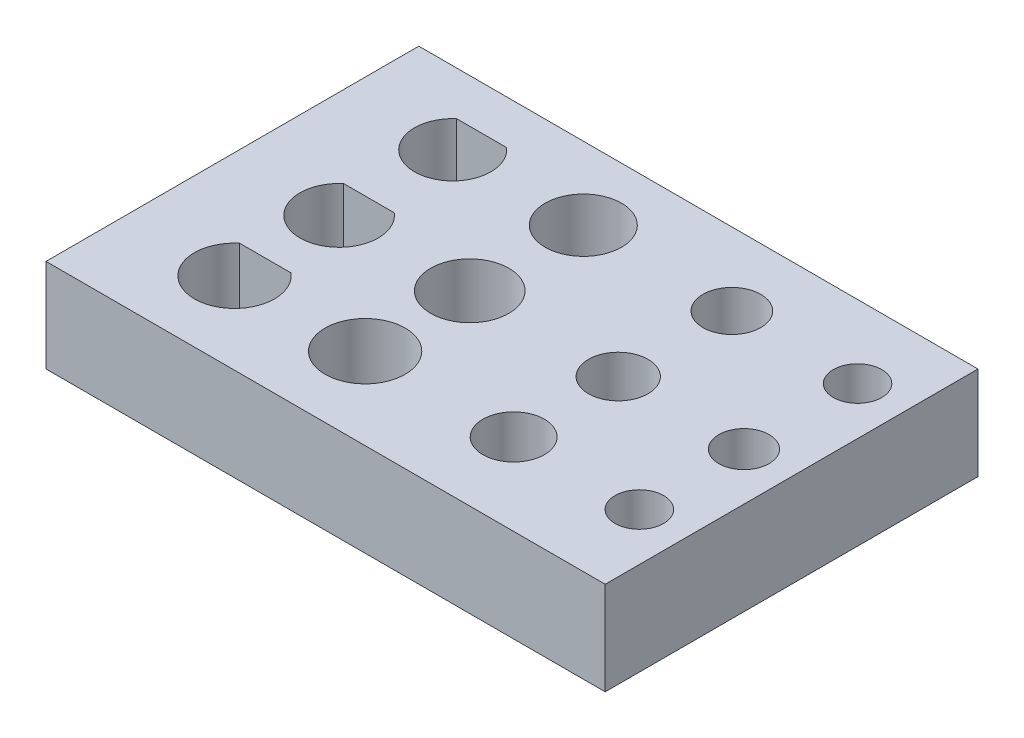
ISO-10303-21;
HEADER;
FILE_DESCRIPTION(('STEP AP214'),'2;1');
FILE_NAME('part.step','',(''),(''),'','','');
FILE_SCHEMA(('AUTOMOTIVE_DESIGN { 1 0 10303 214 1 1 1 1 }'));
ENDSEC;
DATA;
#1=APPLICATION_CONTEXT('core data for automotive mechanical design processes');
#2=APPLICATION_PROTOCOL_DEFINITION('international standard','automotive_design',2000,#1);
#3=PRODUCT_CONTEXT('',#1,'mechanical');
#4=PRODUCT('Part','Part','',(#3));
#5=PRODUCT_RELATED_PRODUCT_CATEGORY('part','',(#4));
#6=PRODUCT_DEFINITION_FORMATION('','',#4);
#7=PRODUCT_DEFINITION_CONTEXT('part definition',#1,'design');
#8=PRODUCT_DEFINITION('design','',#6,#7);
#9=PRODUCT_DEFINITION_SHAPE('','',#8);
#10=(LENGTH_UNIT() NAMED_UNIT(*) SI_UNIT(.MILLI.,.METRE.));
#11=(NAMED_UNIT(*) PLANE_ANGLE_UNIT() SI_UNIT($,.RADIAN.));
#12=(NAMED_UNIT(*) SI_UNIT($,.STERADIAN.) SOLID_ANGLE_UNIT());
#13=UNCERTAINTY_MEASURE_WITH_UNIT(LENGTH_MEASURE(1.E-05),#10,'distance_accuracy_value','');
#14=(GEOMETRIC_REPRESENTATION_CONTEXT(3) GLOBAL_UNCERTAINTY_ASSIGNED_CONTEXT((#13)) GLOBAL_UNIT_ASSIGNED_CONTEXT((#10,
#11,#12)) REPRESENTATION_CONTEXT('',''));
#15=CARTESIAN_POINT('',(0.,0.,0.));
#16=DIRECTION('',(0.,0.,1.));
#17=DIRECTION('',(1.,0.,0.));
#18=AXIS2_PLACEMENT_3D('',#15,#16,#17);
#19=CARTESIAN_POINT('',(0.,5.,0.));
#20=DIRECTION('',(0.,0.,-1.));
#21=DIRECTION('',(-1.,0.,0.));
#22=AXIS2_PLACEMENT_3D('',#19,#20,#21);
#23=PLANE('',#22);
#24=DIRECTION('',(1.,0.,0.));
#25=VECTOR('',#24,1.);
#26=CARTESIAN_POINT('',(0.,0.,0.));
#27=LINE('',#26,#25);
#28=CARTESIAN_POINT('',(0.,0.,0.));
#29=VERTEX_POINT('',#28);
#30=CARTESIAN_POINT('',(30.,0.,0.));
#31=VERTEX_POINT('',#30);
#32=EDGE_CURVE('E212',#29,#31,#27,.T.);
#33=ORIENTED_EDGE('',*,*,#32,.T.);
#34=DIRECTION('',(0.,-1.,0.));
#35=VECTOR('',#34,1.);
#36=CARTESIAN_POINT('',(30.,5.,0.));
#37=LINE('',#36,#35);
#38=CARTESIAN_POINT('',(30.,5.,0.));
#39=VERTEX_POINT('',#38);
#40=EDGE_CURVE('E11',#39,#31,#37,.T.);
#41=ORIENTED_EDGE('',*,*,#40,.F.);
#42=DIRECTION('',(1.,0.,0.));
#43=VECTOR('',#42,1.);
#44=CARTESIAN_POINT('',(0.,5.,0.));
#45=LINE('',#44,#43);
#46=CARTESIAN_POINT('',(0.,5.,0.));
#47=VERTEX_POINT('',#46);
#48=EDGE_CURVE('E215',#47,#39,#45,.T.);
#49=ORIENTED_EDGE('',*,*,#48,.F.);
#50=DIRECTION('',(0.,-1.,0.));
#51=VECTOR('',#50,1.);
#52=CARTESIAN_POINT('',(0.,5.,0.));
#53=LINE('',#52,#51);
#54=EDGE_CURVE('E227',#47,#29,#53,.T.);
#55=ORIENTED_EDGE('',*,*,#54,.T.);
#56=EDGE_LOOP('',(#33,#41,#49,#55));
#57=FACE_BOUND('',#56,.T.);
#58=ADVANCED_FACE('F39',(#57),#23,.F.);
#59=CARTESIAN_POINT('',(30.,5.,0.));
#60=DIRECTION('',(-1.,0.,0.));
#61=DIRECTION('',(0.,0.,1.));
#62=AXIS2_PLACEMENT_3D('',#59,#60,#61);
#63=PLANE('',#62);
#64=DIRECTION('',(0.,0.,-1.));
#65=VECTOR('',#64,1.);
#66=CARTESIAN_POINT('',(30.,0.,0.));
#67=LINE('',#66,#65);
#68=CARTESIAN_POINT('',(30.,0.,-20.));
#69=VERTEX_POINT('',#68);
#70=EDGE_CURVE('E230',#31,#69,#67,.T.);
#71=ORIENTED_EDGE('',*,*,#70,.T.);
#72=DIRECTION('',(0.,-1.,0.));
#73=VECTOR('',#72,1.);
#74=CARTESIAN_POINT('',(30.,5.,-20.));
#75=LINE('',#74,#73);
#76=CARTESIAN_POINT('',(30.,5.,-20.));
#77=VERTEX_POINT('',#76);
#78=EDGE_CURVE('E46',#77,#69,#75,.T.);
#79=ORIENTED_EDGE('',*,*,#78,.F.);
#80=DIRECTION('',(0.,0.,-1.));
#81=VECTOR('',#80,1.);
#82=CARTESIAN_POINT('',(30.,5.,0.));
#83=LINE('',#82,#81);
#84=EDGE_CURVE('E218',#39,#77,#83,.T.);
#85=ORIENTED_EDGE('',*,*,#84,.F.);
#86=ORIENTED_EDGE('',*,*,#40,.T.);
#87=EDGE_LOOP('',(#71,#79,#85,#86));
#88=FACE_BOUND('',#87,.T.);
#89=ADVANCED_FACE('F246',(#88),#63,.F.);
#90=CARTESIAN_POINT('',(0.,5.,-20.));
#91=DIRECTION('',(0.,0.,-1.));
#92=DIRECTION('',(-1.,0.,0.));
#93=AXIS2_PLACEMENT_3D('',#90,#91,#92);
#94=PLANE('',#93);
#95=DIRECTION('',(1.,0.,0.));
#96=VECTOR('',#95,1.);
#97=CARTESIAN_POINT('',(0.,0.,-20.));
#98=LINE('',#97,#96);
#99=CARTESIAN_POINT('',(0.,0.,-20.));
#100=VERTEX_POINT('',#99);
#101=EDGE_CURVE('E233',#100,#69,#98,.T.);
#102=ORIENTED_EDGE('',*,*,#101,.F.);
#103=DIRECTION('',(0.,-1.,0.));
#104=VECTOR('',#103,1.);
#105=CARTESIAN_POINT('',(0.,5.,-20.));
#106=LINE('',#105,#104);
#107=CARTESIAN_POINT('',(0.,5.,-20.));
#108=VERTEX_POINT('',#107);
#109=EDGE_CURVE('E239',#108,#100,#106,.T.);
#110=ORIENTED_EDGE('',*,*,#109,.F.);
#111=DIRECTION('',(1.,0.,0.));
#112=VECTOR('',#111,1.);
#113=CARTESIAN_POINT('',(0.,5.,-20.));
#114=LINE('',#113,#112);
#115=EDGE_CURVE('E221',#108,#77,#114,.T.);
#116=ORIENTED_EDGE('',*,*,#115,.T.);
#117=ORIENTED_EDGE('',*,*,#78,.T.);
#118=EDGE_LOOP('',(#102,#110,#116,#117));
#119=FACE_BOUND('',#118,.T.);
#120=ADVANCED_FACE('F243',(#119),#94,.T.);
#121=CARTESIAN_POINT('',(0.,5.,0.));
#122=DIRECTION('',(-1.,0.,0.));
#123=DIRECTION('',(0.,0.,1.));
#124=AXIS2_PLACEMENT_3D('',#121,#122,#123);
#125=PLANE('',#124);
#126=DIRECTION('',(0.,0.,-1.));
#127=VECTOR('',#126,1.);
#128=CARTESIAN_POINT('',(0.,0.,0.));
#129=LINE('',#128,#127);
#130=EDGE_CURVE('E219',#29,#100,#129,.T.);
#131=ORIENTED_EDGE('',*,*,#130,.F.);
#132=ORIENTED_EDGE('',*,*,#54,.F.);
#133=DIRECTION('',(0.,0.,-1.));
#134=VECTOR('',#133,1.);
#135=CARTESIAN_POINT('',(0.,5.,0.));
#136=LINE('',#135,#134);
#137=EDGE_CURVE('E224',#47,#108,#136,.T.);
#138=ORIENTED_EDGE('',*,*,#137,.T.);
#139=ORIENTED_EDGE('',*,*,#109,.T.);
#140=EDGE_LOOP('',(#131,#132,#138,#139));
#141=FACE_BOUND('',#140,.T.);
#142=ADVANCED_FACE('F253',(#141),#125,.T.);
#143=CARTESIAN_POINT('',(0.,5.,0.));
#144=DIRECTION('',(0.,1.,0.));
#145=DIRECTION('',(0.,0.,1.));
#146=AXIS2_PLACEMENT_3D('',#143,#144,#145);
#147=PLANE('',#146);
#148=CARTESIAN_POINT('',(20.7007957649499,5.,-4.38773686623069));
#149=DIRECTION('',(0.,1.,0.));
#150=DIRECTION('',(0.,0.,1.));
#151=AXIS2_PLACEMENT_3D('',#148,#149,#150);
#152=CIRCLE('',#151,1.65);
#153=CARTESIAN_POINT('',(20.7007957649499,5.,-2.73773686623069));
#154=VERTEX_POINT('',#153);
#155=EDGE_CURVE('E161',#154,#154,#152,.T.);
#156=ORIENTED_EDGE('',*,*,#155,.F.);
#157=EDGE_LOOP('',(#156));
#158=FACE_BOUND('',#157,.T.);
#159=CARTESIAN_POINT('',(5.72533160804216,5.,-4.38773686623069));
#160=DIRECTION('',(0.,1.,0.));
#161=DIRECTION('',(0.,0.,1.));
#162=AXIS2_PLACEMENT_3D('',#159,#160,#161);
#163=CIRCLE('',#162,2.15);
#164=CARTESIAN_POINT('',(4.34692673283313,5.,-6.03773686623069));
#165=VERTEX_POINT('',#164);
#166=CARTESIAN_POINT('',(7.10373648325118,5.,-6.03773686623069));
#167=VERTEX_POINT('',#166);
#168=EDGE_CURVE('E53',#165,#167,#163,.T.);
#169=ORIENTED_EDGE('',*,*,#168,.F.);
#170=DIRECTION('',(-1.,0.,0.));
#171=VECTOR('',#170,1.);
#172=CARTESIAN_POINT('',(4.34692673283313,5.,-6.03773686623069));
#173=LINE('',#172,#171);
#174=EDGE_CURVE('E162',#167,#165,#173,.T.);
#175=ORIENTED_EDGE('',*,*,#174,.F.);
#176=EDGE_LOOP('',(#169,#175));
#177=FACE_BOUND('',#176,.T.);
#178=CARTESIAN_POINT('',(12.7325835816661,5.,-16.0937846010157));
#179=DIRECTION('',(0.,1.,0.));
#180=DIRECTION('',(0.,0.,1.));
#181=AXIS2_PLACEMENT_3D('',#178,#179,#180);
#182=CIRCLE('',#181,2.05);
#183=CARTESIAN_POINT('',(12.7325835816661,5.,-14.0437846010157));
#184=VERTEX_POINT('',#183);
#185=EDGE_CURVE('E150',#184,#184,#182,.T.);
#186=ORIENTED_EDGE('',*,*,#185,.F.);
#187=EDGE_LOOP('',(#186));
#188=FACE_BOUND('',#187,.T.);
#189=CARTESIAN_POINT('',(27.44453044909,5.,-16.0937846010157));
#190=DIRECTION('',(0.,1.,0.));
#191=DIRECTION('',(0.,0.,1.));
#192=AXIS2_PLACEMENT_3D('',#189,#190,#191);
#193=CIRCLE('',#192,1.3);
#194=CARTESIAN_POINT('',(27.44453044909,5.,-14.7937846010157));
#195=VERTEX_POINT('',#194);
#196=EDGE_CURVE('E143',#195,#195,#193,.T.);
#197=ORIENTED_EDGE('',*,*,#196,.F.);
#198=EDGE_LOOP('',(#197));
#199=FACE_BOUND('',#198,.T.);
#200=CARTESIAN_POINT('',(20.7007957649499,5.,-10.));
#201=DIRECTION('',(0.,1.,0.));
#202=DIRECTION('',(0.,0.,1.));
#203=AXIS2_PLACEMENT_3D('',#200,#201,#202);
#204=CIRCLE('',#203,1.6);
#205=CARTESIAN_POINT('',(20.7007957649499,5.,-8.4));
#206=VERTEX_POINT('',#205);
#207=EDGE_CURVE('E189',#206,#206,#204,.T.);
#208=ORIENTED_EDGE('',*,*,#207,.F.);
#209=EDGE_LOOP('',(#208));
#210=FACE_BOUND('',#209,.T.);
#211=CARTESIAN_POINT('',(5.72533160804216,5.,-10.));
#212=DIRECTION('',(0.,1.,0.));
#213=DIRECTION('',(0.,0.,1.));
#214=AXIS2_PLACEMENT_3D('',#211,#212,#213);
#215=CIRCLE('',#214,2.1);
#216=CARTESIAN_POINT('',(4.36518455716861,5.,-11.6));
#217=VERTEX_POINT('',#216);
#218=CARTESIAN_POINT('',(7.0854786589157,5.,-11.6));
#219=VERTEX_POINT('',#218);
#220=EDGE_CURVE('E61',#217,#219,#215,.T.);
#221=ORIENTED_EDGE('',*,*,#220,.F.);
#222=DIRECTION('',(-1.,0.,0.));
#223=VECTOR('',#222,1.);
#224=CARTESIAN_POINT('',(4.36518455716861,5.,-11.6));
#225=LINE('',#224,#223);
#226=EDGE_CURVE('E200',#219,#217,#225,.T.);
#227=ORIENTED_EDGE('',*,*,#226,.F.);
#228=EDGE_LOOP('',(#221,#227));
#229=FACE_BOUND('',#228,.T.);
#230=CARTESIAN_POINT('',(20.7007957649499,5.,-16.0937846010157));
#231=DIRECTION('',(0.,1.,0.));
#232=DIRECTION('',(0.,0.,1.));
#233=AXIS2_PLACEMENT_3D('',#230,#231,#232);
#234=CIRCLE('',#233,1.55);
#235=CARTESIAN_POINT('',(20.7007957649499,5.,-14.5437846010157));
#236=VERTEX_POINT('',#235);
#237=EDGE_CURVE('E177',#236,#236,#234,.T.);
#238=ORIENTED_EDGE('',*,*,#237,.F.);
#239=EDGE_LOOP('',(#238));
#240=FACE_BOUND('',#239,.T.);
#241=CARTESIAN_POINT('',(12.7325835816661,5.,-10.));
#242=DIRECTION('',(0.,1.,0.));
#243=DIRECTION('',(0.,0.,1.));
#244=AXIS2_PLACEMENT_3D('',#241,#242,#243);
#245=CIRCLE('',#244,2.1);
#246=CARTESIAN_POINT('',(12.7325835816661,5.,-7.9));
#247=VERTEX_POINT('',#246);
#248=EDGE_CURVE('E184',#247,#247,#245,.T.);
#249=ORIENTED_EDGE('',*,*,#248,.F.);
#250=EDGE_LOOP('',(#249));
#251=FACE_BOUND('',#250,.T.);
#252=CARTESIAN_POINT('',(27.44453044909,5.,-4.38773686623069));
#253=DIRECTION('',(0.,1.,0.));
#254=DIRECTION('',(0.,0.,1.));
#255=AXIS2_PLACEMENT_3D('',#252,#253,#254);
#256=CIRCLE('',#255,1.3);
#257=CARTESIAN_POINT('',(27.44453044909,5.,-3.08773686623069));
#258=VERTEX_POINT('',#257);
#259=EDGE_CURVE('E176',#258,#258,#256,.T.);
#260=ORIENTED_EDGE('',*,*,#259,.F.);
#261=EDGE_LOOP('',(#260));
#262=FACE_BOUND('',#261,.T.);
#263=CARTESIAN_POINT('',(12.7325835816661,5.,-4.38773686623069));
#264=DIRECTION('',(0.,1.,0.));
#265=DIRECTION('',(0.,0.,1.));
#266=AXIS2_PLACEMENT_3D('',#263,#264,#265);
#267=CIRCLE('',#266,2.15);
#268=CARTESIAN_POINT('',(12.7325835816661,5.,-2.23773686623069));
#269=VERTEX_POINT('',#268);
#270=EDGE_CURVE('E137',#269,#269,#267,.T.);
#271=ORIENTED_EDGE('',*,*,#270,.F.);
#272=EDGE_LOOP('',(#271));
#273=FACE_BOUND('',#272,.T.);
#274=CARTESIAN_POINT('',(5.72533160804215,5.,-16.0937846010157));
#275=DIRECTION('',(0.,1.,0.));
#276=DIRECTION('',(0.,0.,1.));
#277=AXIS2_PLACEMENT_3D('',#274,#275,#276);
#278=CIRCLE('',#277,2.05);
#279=CARTESIAN_POINT('',(4.38369082154228,5.,-17.6437846010157));
#280=VERTEX_POINT('',#279);
#281=CARTESIAN_POINT('',(7.06697239454202,5.,-17.6437846010157));
#282=VERTEX_POINT('',#281);
#283=EDGE_CURVE('E118',#280,#282,#278,.T.);
#284=ORIENTED_EDGE('',*,*,#283,.F.);
#285=DIRECTION('',(-1.,0.,0.));
#286=VECTOR('',#285,1.);
#287=CARTESIAN_POINT('',(4.38369082154228,5.,-17.6437846010157));
#288=LINE('',#287,#286);
#289=EDGE_CURVE('E128',#282,#280,#288,.T.);
#290=ORIENTED_EDGE('',*,*,#289,.F.);
#291=EDGE_LOOP('',(#284,#290));
#292=FACE_BOUND('',#291,.T.);
#293=CARTESIAN_POINT('',(27.44453044909,5.,-10.));
#294=DIRECTION('',(0.,1.,0.));
#295=DIRECTION('',(0.,0.,1.));
#296=AXIS2_PLACEMENT_3D('',#293,#294,#295);
#297=CIRCLE('',#296,1.35);
#298=CARTESIAN_POINT('',(27.44453044909,5.,-8.65));
#299=VERTEX_POINT('',#298);
#300=EDGE_CURVE('E192',#299,#299,#297,.T.);
#301=ORIENTED_EDGE('',*,*,#300,.F.);
#302=EDGE_LOOP('',(#301));
#303=FACE_BOUND('',#302,.T.);
#304=ORIENTED_EDGE('',*,*,#48,.T.);
#305=ORIENTED_EDGE('',*,*,#84,.T.);
#306=ORIENTED_EDGE('',*,*,#115,.F.);
#307=ORIENTED_EDGE('',*,*,#137,.F.);
#308=EDGE_LOOP('',(#304,#305,#306,#307));
#309=FACE_BOUND('',#308,.T.);
#310=ADVANCED_FACE('F132',(#158,#177,#188,#199,#210,#229,#240,#251,#262,#273,#292,#303,#309),
#147,.T.);
#311=CARTESIAN_POINT('',(0.,0.,0.));
#312=DIRECTION('',(0.,1.,0.));
#313=DIRECTION('',(0.,0.,1.));
#314=AXIS2_PLACEMENT_3D('',#311,#312,#313);
#315=PLANE('',#314);
#316=CARTESIAN_POINT('',(20.7007957649499,0.,-4.38773686623069));
#317=DIRECTION('',(0.,1.,0.));
#318=DIRECTION('',(0.,0.,1.));
#319=AXIS2_PLACEMENT_3D('',#316,#317,#318);
#320=CIRCLE('',#319,1.65);
#321=CARTESIAN_POINT('',(20.7007957649499,0.,-2.73773686623069));
#322=VERTEX_POINT('',#321);
#323=EDGE_CURVE('E173',#322,#322,#320,.T.);
#324=ORIENTED_EDGE('',*,*,#323,.T.);
#325=EDGE_LOOP('',(#324));
#326=FACE_BOUND('',#325,.T.);
#327=DIRECTION('',(-1.,0.,0.));
#328=VECTOR('',#327,1.);
#329=CARTESIAN_POINT('',(4.34692673283313,0.,-6.03773686623069));
#330=LINE('',#329,#328);
#331=CARTESIAN_POINT('',(7.10373648325118,0.,-6.03773686623069));
#332=VERTEX_POINT('',#331);
#333=CARTESIAN_POINT('',(4.34692673283313,0.,-6.03773686623069));
#334=VERTEX_POINT('',#333);
#335=EDGE_CURVE('E158',#332,#334,#330,.T.);
#336=ORIENTED_EDGE('',*,*,#335,.T.);
#337=CARTESIAN_POINT('',(5.72533160804216,0.,-4.38773686623069));
#338=DIRECTION('',(0.,1.,0.));
#339=DIRECTION('',(0.,0.,1.));
#340=AXIS2_PLACEMENT_3D('',#337,#338,#339);
#341=CIRCLE('',#340,2.15);
#342=EDGE_CURVE('E165',#334,#332,#341,.T.);
#343=ORIENTED_EDGE('',*,*,#342,.T.);
#344=EDGE_LOOP('',(#336,#343));
#345=FACE_BOUND('',#344,.T.);
#346=CARTESIAN_POINT('',(12.7325835816661,0.,-16.0937846010157));
#347=DIRECTION('',(0.,1.,0.));
#348=DIRECTION('',(0.,0.,1.));
#349=AXIS2_PLACEMENT_3D('',#346,#347,#348);
#350=CIRCLE('',#349,2.05);
#351=CARTESIAN_POINT('',(12.7325835816661,0.,-14.0437846010157));
#352=VERTEX_POINT('',#351);
#353=EDGE_CURVE('E153',#352,#352,#350,.T.);
#354=ORIENTED_EDGE('',*,*,#353,.T.);
#355=EDGE_LOOP('',(#354));
#356=FACE_BOUND('',#355,.T.);
#357=CARTESIAN_POINT('',(27.44453044909,0.,-16.0937846010157));
#358=DIRECTION('',(0.,1.,0.));
#359=DIRECTION('',(0.,0.,1.));
#360=AXIS2_PLACEMENT_3D('',#357,#358,#359);
#361=CIRCLE('',#360,1.3);
#362=CARTESIAN_POINT('',(27.44453044909,0.,-14.7937846010157));
#363=VERTEX_POINT('',#362);
#364=EDGE_CURVE('E147',#363,#363,#361,.T.);
#365=ORIENTED_EDGE('',*,*,#364,.T.);
#366=EDGE_LOOP('',(#365));
#367=FACE_BOUND('',#366,.T.);
#368=CARTESIAN_POINT('',(20.7007957649499,0.,-10.));
#369=DIRECTION('',(0.,1.,0.));
#370=DIRECTION('',(0.,0.,1.));
#371=AXIS2_PLACEMENT_3D('',#368,#369,#370);
#372=CIRCLE('',#371,1.6);
#373=CARTESIAN_POINT('',(20.7007957649499,0.,-8.4));
#374=VERTEX_POINT('',#373);
#375=EDGE_CURVE('E193',#374,#374,#372,.T.);
#376=ORIENTED_EDGE('',*,*,#375,.T.);
#377=EDGE_LOOP('',(#376));
#378=FACE_BOUND('',#377,.T.);
#379=DIRECTION('',(-1.,0.,0.));
#380=VECTOR('',#379,1.);
#381=CARTESIAN_POINT('',(4.36518455716861,0.,-11.6));
#382=LINE('',#381,#380);
#383=CARTESIAN_POINT('',(7.0854786589157,0.,-11.6));
#384=VERTEX_POINT('',#383);
#385=CARTESIAN_POINT('',(4.36518455716861,0.,-11.6));
#386=VERTEX_POINT('',#385);
#387=EDGE_CURVE('E198',#384,#386,#382,.T.);
#388=ORIENTED_EDGE('',*,*,#387,.T.);
#389=CARTESIAN_POINT('',(5.72533160804216,0.,-10.));
#390=DIRECTION('',(0.,1.,0.));
#391=DIRECTION('',(0.,0.,1.));
#392=AXIS2_PLACEMENT_3D('',#389,#390,#391);
#393=CIRCLE('',#392,2.1);
#394=EDGE_CURVE('E203',#386,#384,#393,.T.);
#395=ORIENTED_EDGE('',*,*,#394,.T.);
#396=EDGE_LOOP('',(#388,#395));
#397=FACE_BOUND('',#396,.T.);
#398=CARTESIAN_POINT('',(20.7007957649499,0.,-16.0937846010157));
#399=DIRECTION('',(0.,1.,0.));
#400=DIRECTION('',(0.,0.,1.));
#401=AXIS2_PLACEMENT_3D('',#398,#399,#400);
#402=CIRCLE('',#401,1.55);
#403=CARTESIAN_POINT('',(20.7007957649499,0.,-14.5437846010157));
#404=VERTEX_POINT('',#403);
#405=EDGE_CURVE('E181',#404,#404,#402,.T.);
#406=ORIENTED_EDGE('',*,*,#405,.T.);
#407=EDGE_LOOP('',(#406));
#408=FACE_BOUND('',#407,.T.);
#409=CARTESIAN_POINT('',(12.7325835816661,0.,-10.));
#410=DIRECTION('',(0.,1.,0.));
#411=DIRECTION('',(0.,0.,1.));
#412=AXIS2_PLACEMENT_3D('',#409,#410,#411);
#413=CIRCLE('',#412,2.1);
#414=CARTESIAN_POINT('',(12.7325835816661,0.,-7.9));
#415=VERTEX_POINT('',#414);
#416=EDGE_CURVE('E146',#415,#415,#413,.T.);
#417=ORIENTED_EDGE('',*,*,#416,.T.);
#418=EDGE_LOOP('',(#417));
#419=FACE_BOUND('',#418,.T.);
#420=CARTESIAN_POINT('',(27.44453044909,0.,-4.38773686623069));
#421=DIRECTION('',(0.,1.,0.));
#422=DIRECTION('',(0.,0.,1.));
#423=AXIS2_PLACEMENT_3D('',#420,#421,#422);
#424=CIRCLE('',#423,1.3);
#425=CARTESIAN_POINT('',(27.44453044909,0.,-3.08773686623069));
#426=VERTEX_POINT('',#425);
#427=EDGE_CURVE('E333',#426,#426,#424,.T.);
#428=ORIENTED_EDGE('',*,*,#427,.T.);
#429=EDGE_LOOP('',(#428));
#430=FACE_BOUND('',#429,.T.);
#431=CARTESIAN_POINT('',(12.7325835816661,0.,-4.38773686623069));
#432=DIRECTION('',(0.,1.,0.));
#433=DIRECTION('',(0.,0.,1.));
#434=AXIS2_PLACEMENT_3D('',#431,#432,#433);
#435=CIRCLE('',#434,2.15);
#436=CARTESIAN_POINT('',(12.7325835816661,0.,-2.23773686623069));
#437=VERTEX_POINT('',#436);
#438=EDGE_CURVE('E134',#437,#437,#435,.T.);
#439=ORIENTED_EDGE('',*,*,#438,.T.);
#440=EDGE_LOOP('',(#439));
#441=FACE_BOUND('',#440,.T.);
#442=DIRECTION('',(-1.,0.,0.));
#443=VECTOR('',#442,1.);
#444=CARTESIAN_POINT('',(4.38369082154228,0.,-17.6437846010157));
#445=LINE('',#444,#443);
#446=CARTESIAN_POINT('',(7.06697239454202,0.,-17.6437846010157));
#447=VERTEX_POINT('',#446);
#448=CARTESIAN_POINT('',(4.38369082154228,0.,-17.6437846010157));
#449=VERTEX_POINT('',#448);
#450=EDGE_CURVE('E140',#447,#449,#445,.T.);
#451=ORIENTED_EDGE('',*,*,#450,.T.);
#452=CARTESIAN_POINT('',(5.72533160804215,0.,-16.0937846010157));
#453=DIRECTION('',(0.,1.,0.));
#454=DIRECTION('',(0.,0.,1.));
#455=AXIS2_PLACEMENT_3D('',#452,#453,#454);
#456=CIRCLE('',#455,2.05);
#457=EDGE_CURVE('E121',#449,#447,#456,.T.);
#458=ORIENTED_EDGE('',*,*,#457,.T.);
#459=EDGE_LOOP('',(#451,#458));
#460=FACE_BOUND('',#459,.T.);
#461=CARTESIAN_POINT('',(27.44453044909,0.,-10.));
#462=DIRECTION('',(0.,1.,0.));
#463=DIRECTION('',(0.,0.,1.));
#464=AXIS2_PLACEMENT_3D('',#461,#462,#463);
#465=CIRCLE('',#464,1.35);
#466=CARTESIAN_POINT('',(27.44453044909,0.,-8.65));
#467=VERTEX_POINT('',#466);
#468=EDGE_CURVE('E209',#467,#467,#465,.T.);
#469=ORIENTED_EDGE('',*,*,#468,.T.);
#470=EDGE_LOOP('',(#469));
#471=FACE_BOUND('',#470,.T.);
#472=ORIENTED_EDGE('',*,*,#32,.F.);
#473=ORIENTED_EDGE('',*,*,#130,.T.);
#474=ORIENTED_EDGE('',*,*,#101,.T.);
#475=ORIENTED_EDGE('',*,*,#70,.F.);
#476=EDGE_LOOP('',(#472,#473,#474,#475));
#477=FACE_BOUND('',#476,.T.);
#478=ADVANCED_FACE('F250',(#326,#345,#356,#367,#378,#397,#408,#419,#430,#441,#460,#471,#477),
#315,.F.);
#479=CARTESIAN_POINT('',(27.44453044909,0.,-10.));
#480=DIRECTION('',(0.,1.,0.));
#481=DIRECTION('',(0.,0.,1.));
#482=AXIS2_PLACEMENT_3D('',#479,#480,#481);
#483=CYLINDRICAL_SURFACE('',#482,1.35);
#484=ORIENTED_EDGE('',*,*,#468,.F.);
#485=EDGE_LOOP('',(#484));
#486=FACE_BOUND('',#485,.T.);
#487=ORIENTED_EDGE('',*,*,#300,.T.);
#488=EDGE_LOOP('',(#487));
#489=FACE_BOUND('',#488,.T.);
#490=ADVANCED_FACE('F271',(#486,#489),#483,.F.);
#491=CARTESIAN_POINT('',(5.72533160804215,0.,-16.0937846010157));
#492=DIRECTION('',(0.,1.,0.));
#493=DIRECTION('',(0.,0.,1.));
#494=AXIS2_PLACEMENT_3D('',#491,#492,#493);
#495=CYLINDRICAL_SURFACE('',#494,2.05);
#496=ORIENTED_EDGE('',*,*,#283,.T.);
#497=DIRECTION('',(0.,1.,0.));
#498=VECTOR('',#497,1.);
#499=CARTESIAN_POINT('',(7.06697239454202,0.,-17.6437846010157));
#500=LINE('',#499,#498);
#501=EDGE_CURVE('E125',#447,#282,#500,.T.);
#502=ORIENTED_EDGE('',*,*,#501,.F.);
#503=ORIENTED_EDGE('',*,*,#457,.F.);
#504=DIRECTION('',(0.,1.,0.));
#505=VECTOR('',#504,1.);
#506=CARTESIAN_POINT('',(4.38369082154228,0.,-17.6437846010157));
#507=LINE('',#506,#505);
#508=EDGE_CURVE('E114',#449,#280,#507,.T.);
#509=ORIENTED_EDGE('',*,*,#508,.T.);
#510=EDGE_LOOP('',(#496,#502,#503,#509));
#511=FACE_BOUND('',#510,.T.);
#512=ADVANCED_FACE('F116',(#511),#495,.F.);
#513=CARTESIAN_POINT('',(4.38369082154228,0.,-17.6437846010157));
#514=DIRECTION('',(0.,0.,-1.));
#515=DIRECTION('',(-1.,0.,0.));
#516=AXIS2_PLACEMENT_3D('',#513,#514,#515);
#517=PLANE('',#516);
#518=ORIENTED_EDGE('',*,*,#289,.T.);
#519=ORIENTED_EDGE('',*,*,#508,.F.);
#520=ORIENTED_EDGE('',*,*,#450,.F.);
#521=ORIENTED_EDGE('',*,*,#501,.T.);
#522=EDGE_LOOP('',(#518,#519,#520,#521));
#523=FACE_BOUND('',#522,.T.);
#524=ADVANCED_FACE('F129',(#523),#517,.F.);
#525=CARTESIAN_POINT('',(12.7325835816661,0.,-4.38773686623069));
#526=DIRECTION('',(0.,1.,0.));
#527=DIRECTION('',(0.,0.,1.));
#528=AXIS2_PLACEMENT_3D('',#525,#526,#527);
#529=CYLINDRICAL_SURFACE('',#528,2.15);
#530=ORIENTED_EDGE('',*,*,#438,.F.);
#531=EDGE_LOOP('',(#530));
#532=FACE_BOUND('',#531,.T.);
#533=ORIENTED_EDGE('',*,*,#270,.T.);
#534=EDGE_LOOP('',(#533));
#535=FACE_BOUND('',#534,.T.);
#536=ADVANCED_FACE('F320',(#532,#535),#529,.F.);
#537=CARTESIAN_POINT('',(27.44453044909,0.,-4.38773686623069));
#538=DIRECTION('',(0.,1.,0.));
#539=DIRECTION('',(0.,0.,1.));
#540=AXIS2_PLACEMENT_3D('',#537,#538,#539);
#541=CYLINDRICAL_SURFACE('',#540,1.3);
#542=ORIENTED_EDGE('',*,*,#427,.F.);
#543=EDGE_LOOP('',(#542));
#544=FACE_BOUND('',#543,.T.);
#545=ORIENTED_EDGE('',*,*,#259,.T.);
#546=EDGE_LOOP('',(#545));
#547=FACE_BOUND('',#546,.T.);
#548=ADVANCED_FACE('F295',(#544,#547),#541,.F.);
#549=CARTESIAN_POINT('',(12.7325835816661,0.,-10.));
#550=DIRECTION('',(0.,1.,0.));
#551=DIRECTION('',(0.,0.,1.));
#552=AXIS2_PLACEMENT_3D('',#549,#550,#551);
#553=CYLINDRICAL_SURFACE('',#552,2.1);
#554=ORIENTED_EDGE('',*,*,#416,.F.);
#555=EDGE_LOOP('',(#554));
#556=FACE_BOUND('',#555,.T.);
#557=ORIENTED_EDGE('',*,*,#248,.T.);
#558=EDGE_LOOP('',(#557));
#559=FACE_BOUND('',#558,.T.);
#560=ADVANCED_FACE('F292',(#556,#559),#553,.F.);
#561=CARTESIAN_POINT('',(20.7007957649499,0.,-16.0937846010157));
#562=DIRECTION('',(0.,1.,0.));
#563=DIRECTION('',(0.,0.,1.));
#564=AXIS2_PLACEMENT_3D('',#561,#562,#563);
#565=CYLINDRICAL_SURFACE('',#564,1.55);
#566=ORIENTED_EDGE('',*,*,#405,.F.);
#567=EDGE_LOOP('',(#566));
#568=FACE_BOUND('',#567,.T.);
#569=ORIENTED_EDGE('',*,*,#237,.T.);
#570=EDGE_LOOP('',(#569));
#571=FACE_BOUND('',#570,.T.);
#572=ADVANCED_FACE('F287',(#568,#571),#565,.F.);
#573=CARTESIAN_POINT('',(5.72533160804216,0.,-10.));
#574=DIRECTION('',(0.,1.,0.));
#575=DIRECTION('',(0.,0.,1.));
#576=AXIS2_PLACEMENT_3D('',#573,#574,#575);
#577=CYLINDRICAL_SURFACE('',#576,2.1);
#578=ORIENTED_EDGE('',*,*,#220,.T.);
#579=DIRECTION('',(0.,1.,0.));
#580=VECTOR('',#579,1.);
#581=CARTESIAN_POINT('',(7.0854786589157,0.,-11.6));
#582=LINE('',#581,#580);
#583=EDGE_CURVE('E196',#384,#219,#582,.T.);
#584=ORIENTED_EDGE('',*,*,#583,.F.);
#585=ORIENTED_EDGE('',*,*,#394,.F.);
#586=DIRECTION('',(0.,1.,0.));
#587=VECTOR('',#586,1.);
#588=CARTESIAN_POINT('',(4.36518455716861,0.,-11.6));
#589=LINE('',#588,#587);
#590=EDGE_CURVE('E180',#386,#217,#589,.T.);
#591=ORIENTED_EDGE('',*,*,#590,.T.);
#592=EDGE_LOOP('',(#578,#584,#585,#591));
#593=FACE_BOUND('',#592,.T.);
#594=ADVANCED_FACE('F283',(#593),#577,.F.);
#595=CARTESIAN_POINT('',(4.36518455716861,0.,-11.6));
#596=DIRECTION('',(0.,0.,-1.));
#597=DIRECTION('',(-1.,0.,0.));
#598=AXIS2_PLACEMENT_3D('',#595,#596,#597);
#599=PLANE('',#598);
#600=ORIENTED_EDGE('',*,*,#226,.T.);
#601=ORIENTED_EDGE('',*,*,#590,.F.);
#602=ORIENTED_EDGE('',*,*,#387,.F.);
#603=ORIENTED_EDGE('',*,*,#583,.T.);
#604=EDGE_LOOP('',(#600,#601,#602,#603));
#605=FACE_BOUND('',#604,.T.);
#606=ADVANCED_FACE('F279',(#605),#599,.F.);
#607=CARTESIAN_POINT('',(20.7007957649499,0.,-10.));
#608=DIRECTION('',(0.,1.,0.));
#609=DIRECTION('',(0.,0.,1.));
#610=AXIS2_PLACEMENT_3D('',#607,#608,#609);
#611=CYLINDRICAL_SURFACE('',#610,1.6);
#612=ORIENTED_EDGE('',*,*,#375,.F.);
#613=EDGE_LOOP('',(#612));
#614=FACE_BOUND('',#613,.T.);
#615=ORIENTED_EDGE('',*,*,#207,.T.);
#616=EDGE_LOOP('',(#615));
#617=FACE_BOUND('',#616,.T.);
#618=ADVANCED_FACE('F282',(#614,#617),#611,.F.);
#619=CARTESIAN_POINT('',(27.44453044909,0.,-16.0937846010157));
#620=DIRECTION('',(0.,1.,0.));
#621=DIRECTION('',(0.,0.,1.));
#622=AXIS2_PLACEMENT_3D('',#619,#620,#621);
#623=CYLINDRICAL_SURFACE('',#622,1.3);
#624=ORIENTED_EDGE('',*,*,#364,.F.);
#625=EDGE_LOOP('',(#624));
#626=FACE_BOUND('',#625,.T.);
#627=ORIENTED_EDGE('',*,*,#196,.T.);
#628=EDGE_LOOP('',(#627));
#629=FACE_BOUND('',#628,.T.);
#630=ADVANCED_FACE('F290',(#626,#629),#623,.F.);
#631=CARTESIAN_POINT('',(12.7325835816661,0.,-16.0937846010157));
#632=DIRECTION('',(0.,1.,0.));
#633=DIRECTION('',(0.,0.,1.));
#634=AXIS2_PLACEMENT_3D('',#631,#632,#633);
#635=CYLINDRICAL_SURFACE('',#634,2.05);
#636=ORIENTED_EDGE('',*,*,#353,.F.);
#637=EDGE_LOOP('',(#636));
#638=FACE_BOUND('',#637,.T.);
#639=ORIENTED_EDGE('',*,*,#185,.T.);
#640=EDGE_LOOP('',(#639));
#641=FACE_BOUND('',#640,.T.);
#642=ADVANCED_FACE('F311',(#638,#641),#635,.F.);
#643=CARTESIAN_POINT('',(5.72533160804216,0.,-4.38773686623069));
#644=DIRECTION('',(0.,1.,0.));
#645=DIRECTION('',(0.,0.,1.));
#646=AXIS2_PLACEMENT_3D('',#643,#644,#645);
#647=CYLINDRICAL_SURFACE('',#646,2.15);
#648=ORIENTED_EDGE('',*,*,#168,.T.);
#649=DIRECTION('',(0.,1.,0.));
#650=VECTOR('',#649,1.);
#651=CARTESIAN_POINT('',(7.10373648325118,0.,-6.03773686623069));
#652=LINE('',#651,#650);
#653=EDGE_CURVE('E156',#332,#167,#652,.T.);
#654=ORIENTED_EDGE('',*,*,#653,.F.);
#655=ORIENTED_EDGE('',*,*,#342,.F.);
#656=DIRECTION('',(0.,1.,0.));
#657=VECTOR('',#656,1.);
#658=CARTESIAN_POINT('',(4.34692673283313,0.,-6.03773686623069));
#659=LINE('',#658,#657);
#660=EDGE_CURVE('E159',#334,#165,#659,.T.);
#661=ORIENTED_EDGE('',*,*,#660,.T.);
#662=EDGE_LOOP('',(#648,#654,#655,#661));
#663=FACE_BOUND('',#662,.T.);
#664=ADVANCED_FACE('F307',(#663),#647,.F.);
#665=CARTESIAN_POINT('',(4.34692673283313,0.,-6.03773686623069));
#666=DIRECTION('',(0.,0.,-1.));
#667=DIRECTION('',(-1.,0.,0.));
#668=AXIS2_PLACEMENT_3D('',#665,#666,#667);
#669=PLANE('',#668);
#670=ORIENTED_EDGE('',*,*,#174,.T.);
#671=ORIENTED_EDGE('',*,*,#660,.F.);
#672=ORIENTED_EDGE('',*,*,#335,.F.);
#673=ORIENTED_EDGE('',*,*,#653,.T.);
#674=EDGE_LOOP('',(#670,#671,#672,#673));
#675=FACE_BOUND('',#674,.T.);
#676=ADVANCED_FACE('F303',(#675),#669,.F.);
#677=CARTESIAN_POINT('',(20.7007957649499,0.,-4.38773686623069));
#678=DIRECTION('',(0.,1.,0.));
#679=DIRECTION('',(0.,0.,1.));
#680=AXIS2_PLACEMENT_3D('',#677,#678,#679);
#681=CYLINDRICAL_SURFACE('',#680,1.65);
#682=ORIENTED_EDGE('',*,*,#323,.F.);
#683=EDGE_LOOP('',(#682));
#684=FACE_BOUND('',#683,.T.);
#685=ORIENTED_EDGE('',*,*,#155,.T.);
#686=EDGE_LOOP('',(#685));
#687=FACE_BOUND('',#686,.T.);
#688=ADVANCED_FACE('F300',(#684,#687),#681,.F.);
#689=CLOSED_SHELL('',(#58,#89,#120,#142,#310,#478,#490,#512,#524,#536,#548,#560,#572,#594,#606,
#618,#630,#642,#664,#676,#688));
#690=MANIFOLD_SOLID_BREP('B2',#689);
#691=ADVANCED_BREP_SHAPE_REPRESENTATION('',(#18,#690),#14);
#692=SHAPE_DEFINITION_REPRESENTATION(#9,#691);
ENDSEC;
END-ISO-10303-21;
